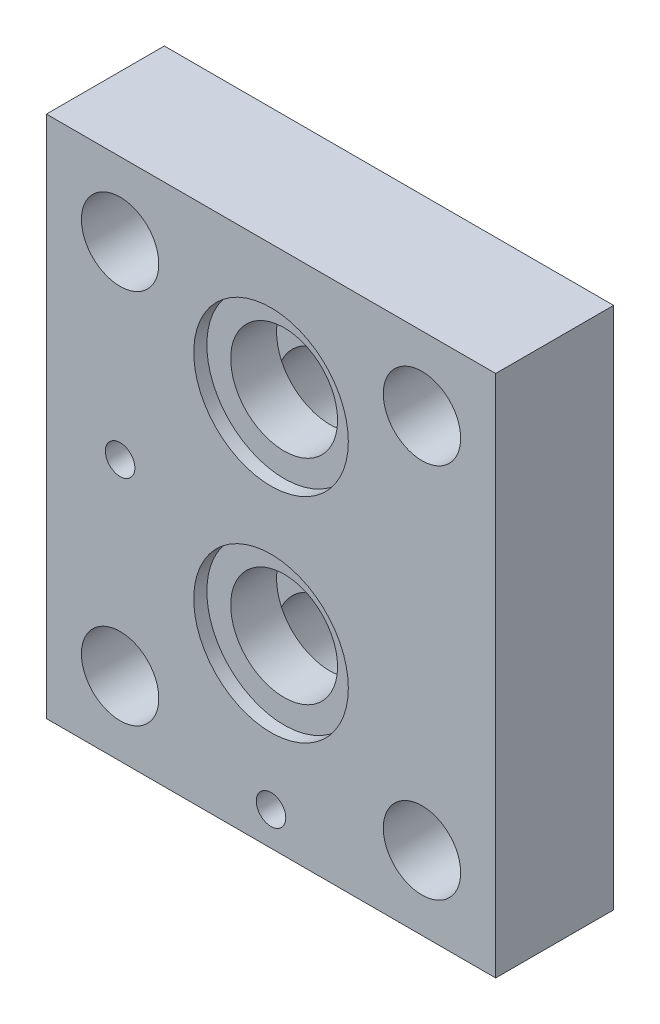
ISO-10303-21;
HEADER;
FILE_DESCRIPTION(('STEP AP214'),'2;1');
FILE_NAME('part.step','',(''),(''),'','','');
FILE_SCHEMA(('AUTOMOTIVE_DESIGN { 1 0 10303 214 1 1 1 1 }'));
ENDSEC;
DATA;
#1=APPLICATION_CONTEXT('core data for automotive mechanical design processes');
#2=APPLICATION_PROTOCOL_DEFINITION('international standard','automotive_design',2000,#1);
#3=PRODUCT_CONTEXT('',#1,'mechanical');
#4=PRODUCT('Part','Part','',(#3));
#5=PRODUCT_RELATED_PRODUCT_CATEGORY('part','',(#4));
#6=PRODUCT_DEFINITION_FORMATION('','',#4);
#7=PRODUCT_DEFINITION_CONTEXT('part definition',#1,'design');
#8=PRODUCT_DEFINITION('design','',#6,#7);
#9=PRODUCT_DEFINITION_SHAPE('','',#8);
#10=(LENGTH_UNIT() NAMED_UNIT(*) SI_UNIT(.MILLI.,.METRE.));
#11=(NAMED_UNIT(*) PLANE_ANGLE_UNIT() SI_UNIT($,.RADIAN.));
#12=(NAMED_UNIT(*) SI_UNIT($,.STERADIAN.) SOLID_ANGLE_UNIT());
#13=UNCERTAINTY_MEASURE_WITH_UNIT(LENGTH_MEASURE(1.E-05),#10,'distance_accuracy_value','');
#14=(GEOMETRIC_REPRESENTATION_CONTEXT(3) GLOBAL_UNCERTAINTY_ASSIGNED_CONTEXT((#13)) GLOBAL_UNIT_ASSIGNED_CONTEXT((#10,
#11,#12)) REPRESENTATION_CONTEXT('',''));
#15=CARTESIAN_POINT('',(0.,0.,0.));
#16=DIRECTION('',(0.,0.,1.));
#17=DIRECTION('',(1.,0.,0.));
#18=AXIS2_PLACEMENT_3D('',#15,#16,#17);
#19=CARTESIAN_POINT('',(0.,27.813,0.));
#20=DIRECTION('',(0.,0.,1.));
#21=DIRECTION('',(1.,0.,0.));
#22=AXIS2_PLACEMENT_3D('',#19,#20,#21);
#23=CYLINDRICAL_SURFACE('',#22,11.509375);
#24=CARTESIAN_POINT('',(0.,27.813,0.));
#25=DIRECTION('',(0.,0.,1.));
#26=DIRECTION('',(1.,0.,0.));
#27=AXIS2_PLACEMENT_3D('',#24,#25,#26);
#28=CIRCLE('',#27,11.509375);
#29=CARTESIAN_POINT('',(-10.4487050341478,22.987,0.));
#30=VERTEX_POINT('',#29);
#31=CARTESIAN_POINT('',(10.4487050341478,22.987,0.));
#32=VERTEX_POINT('',#31);
#33=EDGE_CURVE('E100',#30,#32,#28,.T.);
#34=ORIENTED_EDGE('',*,*,#33,.F.);
#35=EDGE_CURVE('E59',#32,#30,#28,.T.);
#36=ORIENTED_EDGE('',*,*,#35,.F.);
#37=EDGE_LOOP('',(#34,#36));
#38=FACE_BOUND('',#37,.T.);
#39=CARTESIAN_POINT('',(0.,27.813,9.8806));
#40=DIRECTION('',(0.,0.,1.));
#41=DIRECTION('',(1.,0.,0.));
#42=AXIS2_PLACEMENT_3D('',#39,#40,#41);
#43=CIRCLE('',#42,11.509375);
#44=CARTESIAN_POINT('',(11.509375,27.813,9.8806));
#45=VERTEX_POINT('',#44);
#46=EDGE_CURVE('E47',#45,#45,#43,.F.);
#47=ORIENTED_EDGE('',*,*,#46,.F.);
#48=EDGE_LOOP('',(#47));
#49=FACE_BOUND('',#48,.T.);
#50=ADVANCED_FACE('F43',(#38,#49),#23,.F.);
#51=CARTESIAN_POINT('',(0.,-18.161,0.));
#52=DIRECTION('',(0.,0.,1.));
#53=DIRECTION('',(1.,0.,0.));
#54=AXIS2_PLACEMENT_3D('',#51,#52,#53);
#55=CYLINDRICAL_SURFACE('',#54,11.509375);
#56=CARTESIAN_POINT('',(0.,-18.161,0.));
#57=DIRECTION('',(0.,0.,1.));
#58=DIRECTION('',(1.,0.,0.));
#59=AXIS2_PLACEMENT_3D('',#56,#57,#58);
#60=CIRCLE('',#59,11.509375);
#61=CARTESIAN_POINT('',(-10.4487050341478,-22.987,0.));
#62=VERTEX_POINT('',#61);
#63=CARTESIAN_POINT('',(10.4487050341478,-22.987,0.));
#64=VERTEX_POINT('',#63);
#65=EDGE_CURVE('E120',#62,#64,#60,.T.);
#66=ORIENTED_EDGE('',*,*,#65,.F.);
#67=EDGE_CURVE('E66',#64,#62,#60,.T.);
#68=ORIENTED_EDGE('',*,*,#67,.F.);
#69=EDGE_LOOP('',(#66,#68));
#70=FACE_BOUND('',#69,.T.);
#71=CARTESIAN_POINT('',(0.,-18.161,9.8806));
#72=DIRECTION('',(0.,0.,1.));
#73=DIRECTION('',(1.,0.,0.));
#74=AXIS2_PLACEMENT_3D('',#71,#72,#73);
#75=CIRCLE('',#74,11.509375);
#76=CARTESIAN_POINT('',(11.509375,-18.161,9.8806));
#77=VERTEX_POINT('',#76);
#78=EDGE_CURVE('E101',#77,#77,#75,.F.);
#79=ORIENTED_EDGE('',*,*,#78,.F.);
#80=EDGE_LOOP('',(#79));
#81=FACE_BOUND('',#80,.T.);
#82=ADVANCED_FACE('F279',(#70,#81),#55,.F.);
#83=CARTESIAN_POINT('',(48.387,56.388,12.7));
#84=DIRECTION('',(0.,-1.,0.));
#85=DIRECTION('',(0.,0.,-1.));
#86=AXIS2_PLACEMENT_3D('',#83,#84,#85);
#87=PLANE('',#86);
#88=DIRECTION('',(-1.,0.,0.));
#89=VECTOR('',#88,1.);
#90=CARTESIAN_POINT('',(48.387,56.388,-12.7));
#91=LINE('',#90,#89);
#92=CARTESIAN_POINT('',(48.387,56.388,-12.7));
#93=VERTEX_POINT('',#92);
#94=CARTESIAN_POINT('',(-48.387,56.388,-12.7));
#95=VERTEX_POINT('',#94);
#96=EDGE_CURVE('E148',#93,#95,#91,.T.);
#97=ORIENTED_EDGE('',*,*,#96,.T.);
#98=DIRECTION('',(0.,0.,-1.));
#99=VECTOR('',#98,1.);
#100=CARTESIAN_POINT('',(-48.387,56.388,12.7));
#101=LINE('',#100,#99);
#102=CARTESIAN_POINT('',(-48.387,56.388,12.7));
#103=VERTEX_POINT('',#102);
#104=EDGE_CURVE('E11',#103,#95,#101,.T.);
#105=ORIENTED_EDGE('',*,*,#104,.F.);
#106=DIRECTION('',(-1.,0.,0.));
#107=VECTOR('',#106,1.);
#108=CARTESIAN_POINT('',(48.387,56.388,12.7));
#109=LINE('',#108,#107);
#110=CARTESIAN_POINT('',(48.387,56.388,12.7));
#111=VERTEX_POINT('',#110);
#112=EDGE_CURVE('E151',#111,#103,#109,.T.);
#113=ORIENTED_EDGE('',*,*,#112,.F.);
#114=DIRECTION('',(0.,0.,-1.));
#115=VECTOR('',#114,1.);
#116=CARTESIAN_POINT('',(48.387,56.388,12.7));
#117=LINE('',#116,#115);
#118=EDGE_CURVE('E161',#111,#93,#117,.T.);
#119=ORIENTED_EDGE('',*,*,#118,.T.);
#120=EDGE_LOOP('',(#97,#105,#113,#119));
#121=FACE_BOUND('',#120,.T.);
#122=ADVANCED_FACE('F45',(#121),#87,.F.);
#123=CARTESIAN_POINT('',(-48.387,-56.388,12.7));
#124=DIRECTION('',(1.,0.,0.));
#125=DIRECTION('',(0.,0.,-1.));
#126=AXIS2_PLACEMENT_3D('',#123,#124,#125);
#127=PLANE('',#126);
#128=DIRECTION('',(0.,-1.,0.));
#129=VECTOR('',#128,1.);
#130=CARTESIAN_POINT('',(-48.387,-56.388,-12.7));
#131=LINE('',#130,#129);
#132=CARTESIAN_POINT('',(-48.387,-56.388,-12.7));
#133=VERTEX_POINT('',#132);
#134=EDGE_CURVE('E164',#95,#133,#131,.T.);
#135=ORIENTED_EDGE('',*,*,#134,.T.);
#136=DIRECTION('',(0.,0.,-1.));
#137=VECTOR('',#136,1.);
#138=CARTESIAN_POINT('',(-48.387,-56.388,12.7));
#139=LINE('',#138,#137);
#140=CARTESIAN_POINT('',(-48.387,-56.388,12.7));
#141=VERTEX_POINT('',#140);
#142=EDGE_CURVE('E52',#141,#133,#139,.T.);
#143=ORIENTED_EDGE('',*,*,#142,.F.);
#144=DIRECTION('',(0.,-1.,0.));
#145=VECTOR('',#144,1.);
#146=CARTESIAN_POINT('',(-48.387,-56.388,12.7));
#147=LINE('',#146,#145);
#148=EDGE_CURVE('E154',#103,#141,#147,.T.);
#149=ORIENTED_EDGE('',*,*,#148,.F.);
#150=ORIENTED_EDGE('',*,*,#104,.T.);
#151=EDGE_LOOP('',(#135,#143,#149,#150));
#152=FACE_BOUND('',#151,.T.);
#153=ADVANCED_FACE('F255',(#152),#127,.F.);
#154=CARTESIAN_POINT('',(48.387,-56.388,12.7));
#155=DIRECTION('',(0.,1.,0.));
#156=DIRECTION('',(0.,0.,1.));
#157=AXIS2_PLACEMENT_3D('',#154,#155,#156);
#158=PLANE('',#157);
#159=DIRECTION('',(1.,0.,0.));
#160=VECTOR('',#159,1.);
#161=CARTESIAN_POINT('',(48.387,-56.388,-12.7));
#162=LINE('',#161,#160);
#163=CARTESIAN_POINT('',(48.387,-56.388,-12.7));
#164=VERTEX_POINT('',#163);
#165=EDGE_CURVE('E166',#133,#164,#162,.T.);
#166=ORIENTED_EDGE('',*,*,#165,.T.);
#167=DIRECTION('',(0.,0.,-1.));
#168=VECTOR('',#167,1.);
#169=CARTESIAN_POINT('',(48.387,-56.388,12.7));
#170=LINE('',#169,#168);
#171=CARTESIAN_POINT('',(48.387,-56.388,12.7));
#172=VERTEX_POINT('',#171);
#173=EDGE_CURVE('E171',#172,#164,#170,.T.);
#174=ORIENTED_EDGE('',*,*,#173,.F.);
#175=DIRECTION('',(1.,0.,0.));
#176=VECTOR('',#175,1.);
#177=CARTESIAN_POINT('',(48.387,-56.388,12.7));
#178=LINE('',#177,#176);
#179=EDGE_CURVE('E157',#141,#172,#178,.T.);
#180=ORIENTED_EDGE('',*,*,#179,.F.);
#181=ORIENTED_EDGE('',*,*,#142,.T.);
#182=EDGE_LOOP('',(#166,#174,#180,#181));
#183=FACE_BOUND('',#182,.T.);
#184=ADVANCED_FACE('F260',(#183),#158,.F.);
#185=CARTESIAN_POINT('',(48.387,-56.388,12.7));
#186=DIRECTION('',(-1.,0.,0.));
#187=DIRECTION('',(0.,0.,1.));
#188=AXIS2_PLACEMENT_3D('',#185,#186,#187);
#189=PLANE('',#188);
#190=DIRECTION('',(0.,1.,0.));
#191=VECTOR('',#190,1.);
#192=CARTESIAN_POINT('',(48.387,-56.388,-12.7));
#193=LINE('',#192,#191);
#194=EDGE_CURVE('E155',#164,#93,#193,.T.);
#195=ORIENTED_EDGE('',*,*,#194,.T.);
#196=ORIENTED_EDGE('',*,*,#118,.F.);
#197=DIRECTION('',(0.,1.,0.));
#198=VECTOR('',#197,1.);
#199=CARTESIAN_POINT('',(48.387,-56.388,12.7));
#200=LINE('',#199,#198);
#201=EDGE_CURVE('E159',#172,#111,#200,.T.);
#202=ORIENTED_EDGE('',*,*,#201,.F.);
#203=ORIENTED_EDGE('',*,*,#173,.T.);
#204=EDGE_LOOP('',(#195,#196,#202,#203));
#205=FACE_BOUND('',#204,.T.);
#206=ADVANCED_FACE('F231',(#205),#189,.F.);
#207=CARTESIAN_POINT('',(0.,0.,12.7));
#208=DIRECTION('',(0.,0.,-1.));
#209=DIRECTION('',(-1.,0.,0.));
#210=AXIS2_PLACEMENT_3D('',#207,#208,#209);
#211=PLANE('',#210);
#212=CARTESIAN_POINT('',(-32.512,-0.127000000000009,12.7));
#213=DIRECTION('',(0.,0.,1.));
#214=DIRECTION('',(1.,0.,0.));
#215=AXIS2_PLACEMENT_3D('',#212,#213,#214);
#216=CIRCLE('',#215,3.175);
#217=CARTESIAN_POINT('',(-29.337,-0.127000000000009,12.7));
#218=VERTEX_POINT('',#217);
#219=EDGE_CURVE('E212',#218,#218,#216,.T.);
#220=ORIENTED_EDGE('',*,*,#219,.F.);
#221=EDGE_LOOP('',(#220));
#222=FACE_BOUND('',#221,.T.);
#223=CARTESIAN_POINT('',(0.,-49.149,12.7));
#224=DIRECTION('',(0.,0.,1.));
#225=DIRECTION('',(1.,0.,0.));
#226=AXIS2_PLACEMENT_3D('',#223,#224,#225);
#227=CIRCLE('',#226,3.175);
#228=CARTESIAN_POINT('',(3.175,-49.149,12.7));
#229=VERTEX_POINT('',#228);
#230=EDGE_CURVE('E206',#229,#229,#227,.T.);
#231=ORIENTED_EDGE('',*,*,#230,.F.);
#232=EDGE_LOOP('',(#231));
#233=FACE_BOUND('',#232,.T.);
#234=CARTESIAN_POINT('',(0.,27.813,12.7));
#235=DIRECTION('',(0.,0.,1.));
#236=DIRECTION('',(1.,0.,0.));
#237=AXIS2_PLACEMENT_3D('',#234,#235,#236);
#238=CIRCLE('',#237,16.6497);
#239=CARTESIAN_POINT('',(16.6497,27.813,12.7));
#240=VERTEX_POINT('',#239);
#241=EDGE_CURVE('E187',#240,#240,#238,.T.);
#242=ORIENTED_EDGE('',*,*,#241,.F.);
#243=EDGE_LOOP('',(#242));
#244=FACE_BOUND('',#243,.T.);
#245=CARTESIAN_POINT('',(0.,-18.161,12.7));
#246=DIRECTION('',(0.,0.,1.));
#247=DIRECTION('',(1.,0.,0.));
#248=AXIS2_PLACEMENT_3D('',#245,#246,#247);
#249=CIRCLE('',#248,16.6497);
#250=CARTESIAN_POINT('',(16.6497,-18.161,12.7));
#251=VERTEX_POINT('',#250);
#252=EDGE_CURVE('E180',#251,#251,#249,.T.);
#253=ORIENTED_EDGE('',*,*,#252,.F.);
#254=EDGE_LOOP('',(#253));
#255=FACE_BOUND('',#254,.T.);
#256=CARTESIAN_POINT('',(32.512,40.513,12.7));
#257=DIRECTION('',(0.,0.,-1.));
#258=DIRECTION('',(-1.,0.,0.));
#259=AXIS2_PLACEMENT_3D('',#256,#257,#258);
#260=CIRCLE('',#259,8.334375);
#261=CARTESIAN_POINT('',(24.177625,40.513,12.7));
#262=VERTEX_POINT('',#261);
#263=EDGE_CURVE('E131',#262,#262,#260,.T.);
#264=ORIENTED_EDGE('',*,*,#263,.T.);
#265=EDGE_LOOP('',(#264));
#266=FACE_BOUND('',#265,.T.);
#267=CARTESIAN_POINT('',(-32.512,-40.513,12.7));
#268=DIRECTION('',(0.,0.,-1.));
#269=DIRECTION('',(-1.,0.,0.));
#270=AXIS2_PLACEMENT_3D('',#267,#268,#269);
#271=CIRCLE('',#270,8.334375);
#272=CARTESIAN_POINT('',(-40.846375,-40.513,12.7));
#273=VERTEX_POINT('',#272);
#274=EDGE_CURVE('E134',#273,#273,#271,.T.);
#275=ORIENTED_EDGE('',*,*,#274,.T.);
#276=EDGE_LOOP('',(#275));
#277=FACE_BOUND('',#276,.T.);
#278=CARTESIAN_POINT('',(-32.512,40.513,12.7));
#279=DIRECTION('',(0.,0.,-1.));
#280=DIRECTION('',(-1.,0.,0.));
#281=AXIS2_PLACEMENT_3D('',#278,#279,#280);
#282=CIRCLE('',#281,8.334375);
#283=CARTESIAN_POINT('',(-40.846375,40.513,12.7));
#284=VERTEX_POINT('',#283);
#285=EDGE_CURVE('E140',#284,#284,#282,.T.);
#286=ORIENTED_EDGE('',*,*,#285,.T.);
#287=EDGE_LOOP('',(#286));
#288=FACE_BOUND('',#287,.T.);
#289=CARTESIAN_POINT('',(32.512,-40.513,12.7));
#290=DIRECTION('',(0.,0.,-1.));
#291=DIRECTION('',(-1.,0.,0.));
#292=AXIS2_PLACEMENT_3D('',#289,#290,#291);
#293=CIRCLE('',#292,8.334375);
#294=CARTESIAN_POINT('',(24.177625,-40.513,12.7));
#295=VERTEX_POINT('',#294);
#296=EDGE_CURVE('E130',#295,#295,#293,.T.);
#297=ORIENTED_EDGE('',*,*,#296,.T.);
#298=EDGE_LOOP('',(#297));
#299=FACE_BOUND('',#298,.T.);
#300=ORIENTED_EDGE('',*,*,#112,.T.);
#301=ORIENTED_EDGE('',*,*,#148,.T.);
#302=ORIENTED_EDGE('',*,*,#179,.T.);
#303=ORIENTED_EDGE('',*,*,#201,.T.);
#304=EDGE_LOOP('',(#300,#301,#302,#303));
#305=FACE_BOUND('',#304,.T.);
#306=ADVANCED_FACE('F227',(#222,#233,#244,#255,#266,#277,#288,#299,#305),#211,.F.);
#307=CARTESIAN_POINT('',(0.,0.,-12.7));
#308=DIRECTION('',(0.,0.,-1.));
#309=DIRECTION('',(-1.,0.,0.));
#310=AXIS2_PLACEMENT_3D('',#307,#308,#309);
#311=PLANE('',#310);
#312=CARTESIAN_POINT('',(32.512,0.126999999999986,-12.7));
#313=DIRECTION('',(0.,0.,1.));
#314=DIRECTION('',(1.,0.,0.));
#315=AXIS2_PLACEMENT_3D('',#312,#313,#314);
#316=CIRCLE('',#315,3.571875);
#317=CARTESIAN_POINT('',(36.083875,0.126999999999986,-12.7));
#318=VERTEX_POINT('',#317);
#319=EDGE_CURVE('E200',#318,#318,#316,.T.);
#320=ORIENTED_EDGE('',*,*,#319,.T.);
#321=EDGE_LOOP('',(#320));
#322=FACE_BOUND('',#321,.T.);
#323=CARTESIAN_POINT('',(0.,49.149,-12.7));
#324=DIRECTION('',(0.,0.,1.));
#325=DIRECTION('',(1.,0.,0.));
#326=AXIS2_PLACEMENT_3D('',#323,#324,#325);
#327=CIRCLE('',#326,3.571875);
#328=CARTESIAN_POINT('',(3.571875,49.149,-12.7));
#329=VERTEX_POINT('',#328);
#330=EDGE_CURVE('E194',#329,#329,#327,.T.);
#331=ORIENTED_EDGE('',*,*,#330,.T.);
#332=EDGE_LOOP('',(#331));
#333=FACE_BOUND('',#332,.T.);
#334=CARTESIAN_POINT('',(0.,18.161,-12.7));
#335=DIRECTION('',(0.,0.,1.));
#336=DIRECTION('',(1.,0.,0.));
#337=AXIS2_PLACEMENT_3D('',#334,#335,#336);
#338=CIRCLE('',#337,11.509375);
#339=CARTESIAN_POINT('',(11.509375,18.161,-12.7));
#340=VERTEX_POINT('',#339);
#341=EDGE_CURVE('E110',#340,#340,#338,.T.);
#342=ORIENTED_EDGE('',*,*,#341,.T.);
#343=EDGE_LOOP('',(#342));
#344=FACE_BOUND('',#343,.T.);
#345=CARTESIAN_POINT('',(0.,-27.813,-12.7));
#346=DIRECTION('',(0.,0.,1.));
#347=DIRECTION('',(1.,0.,0.));
#348=AXIS2_PLACEMENT_3D('',#345,#346,#347);
#349=CIRCLE('',#348,11.509375);
#350=CARTESIAN_POINT('',(11.509375,-27.813,-12.7));
#351=VERTEX_POINT('',#350);
#352=EDGE_CURVE('E114',#351,#351,#349,.T.);
#353=ORIENTED_EDGE('',*,*,#352,.T.);
#354=EDGE_LOOP('',(#353));
#355=FACE_BOUND('',#354,.T.);
#356=CARTESIAN_POINT('',(32.512,40.513,-12.7));
#357=DIRECTION('',(0.,0.,1.));
#358=DIRECTION('',(1.,0.,0.));
#359=AXIS2_PLACEMENT_3D('',#356,#357,#358);
#360=CIRCLE('',#359,8.334375);
#361=CARTESIAN_POINT('',(24.177625,40.513,-12.7));
#362=VERTEX_POINT('',#361);
#363=EDGE_CURVE('E127',#362,#362,#360,.T.);
#364=ORIENTED_EDGE('',*,*,#363,.T.);
#365=EDGE_LOOP('',(#364));
#366=FACE_BOUND('',#365,.T.);
#367=CARTESIAN_POINT('',(-32.512,-40.513,-12.7));
#368=DIRECTION('',(0.,0.,1.));
#369=DIRECTION('',(1.,0.,0.));
#370=AXIS2_PLACEMENT_3D('',#367,#368,#369);
#371=CIRCLE('',#370,8.334375);
#372=CARTESIAN_POINT('',(-40.846375,-40.513,-12.7));
#373=VERTEX_POINT('',#372);
#374=EDGE_CURVE('E137',#373,#373,#371,.T.);
#375=ORIENTED_EDGE('',*,*,#374,.T.);
#376=EDGE_LOOP('',(#375));
#377=FACE_BOUND('',#376,.T.);
#378=CARTESIAN_POINT('',(-32.512,40.513,-12.7));
#379=DIRECTION('',(0.,0.,1.));
#380=DIRECTION('',(1.,0.,0.));
#381=AXIS2_PLACEMENT_3D('',#378,#379,#380);
#382=CIRCLE('',#381,8.334375);
#383=CARTESIAN_POINT('',(-40.846375,40.513,-12.7));
#384=VERTEX_POINT('',#383);
#385=EDGE_CURVE('E125',#384,#384,#382,.T.);
#386=ORIENTED_EDGE('',*,*,#385,.T.);
#387=EDGE_LOOP('',(#386));
#388=FACE_BOUND('',#387,.T.);
#389=CARTESIAN_POINT('',(32.512,-40.513,-12.7));
#390=DIRECTION('',(0.,0.,1.));
#391=DIRECTION('',(1.,0.,0.));
#392=AXIS2_PLACEMENT_3D('',#389,#390,#391);
#393=CIRCLE('',#392,8.334375);
#394=CARTESIAN_POINT('',(24.177625,-40.513,-12.7));
#395=VERTEX_POINT('',#394);
#396=EDGE_CURVE('E145',#395,#395,#393,.T.);
#397=ORIENTED_EDGE('',*,*,#396,.T.);
#398=EDGE_LOOP('',(#397));
#399=FACE_BOUND('',#398,.T.);
#400=ORIENTED_EDGE('',*,*,#96,.F.);
#401=ORIENTED_EDGE('',*,*,#194,.F.);
#402=ORIENTED_EDGE('',*,*,#165,.F.);
#403=ORIENTED_EDGE('',*,*,#134,.F.);
#404=EDGE_LOOP('',(#400,#401,#402,#403));
#405=FACE_BOUND('',#404,.T.);
#406=ADVANCED_FACE('F230',(#322,#333,#344,#355,#366,#377,#388,#399,#405),#311,.T.);
#407=CARTESIAN_POINT('',(32.512,-40.513,12.701));
#408=DIRECTION('',(0.,0.,-1.));
#409=DIRECTION('',(-1.,0.,0.));
#410=AXIS2_PLACEMENT_3D('',#407,#408,#409);
#411=CYLINDRICAL_SURFACE('',#410,8.334375);
#412=CARTESIAN_POINT('',(24.177625,-40.513,-12.7));
#413=CARTESIAN_POINT('',(24.177625,-40.513,-12.4354166666667));
#414=CARTESIAN_POINT('',(24.177625,-40.513,-12.1708333333333));
#415=CARTESIAN_POINT('',(24.177625,-40.513,-11.6416666666667));
#416=CARTESIAN_POINT('',(24.177625,-40.513,-11.3770833333333));
#417=CARTESIAN_POINT('',(24.177625,-40.513,-10.8479166666667));
#418=CARTESIAN_POINT('',(24.177625,-40.513,-10.5833333333333));
#419=CARTESIAN_POINT('',(24.177625,-40.513,-10.0541666666667));
#420=CARTESIAN_POINT('',(24.177625,-40.513,-9.78958333333334));
#421=CARTESIAN_POINT('',(24.177625,-40.513,-9.26041666666667));
#422=CARTESIAN_POINT('',(24.177625,-40.513,-8.99583333333334));
#423=CARTESIAN_POINT('',(24.177625,-40.513,-8.46666666666667));
#424=CARTESIAN_POINT('',(24.177625,-40.513,-8.20208333333333));
#425=CARTESIAN_POINT('',(24.177625,-40.513,-7.67291666666667));
#426=CARTESIAN_POINT('',(24.177625,-40.513,-7.40833333333333));
#427=CARTESIAN_POINT('',(24.177625,-40.513,-6.87916666666667));
#428=CARTESIAN_POINT('',(24.177625,-40.513,-6.61458333333333));
#429=CARTESIAN_POINT('',(24.177625,-40.513,-6.08541666666667));
#430=CARTESIAN_POINT('',(24.177625,-40.513,-5.82083333333333));
#431=CARTESIAN_POINT('',(24.177625,-40.513,-5.29166666666667));
#432=CARTESIAN_POINT('',(24.177625,-40.513,-5.02708333333334));
#433=CARTESIAN_POINT('',(24.177625,-40.513,-4.49791666666667));
#434=CARTESIAN_POINT('',(24.177625,-40.513,-4.23333333333333));
#435=CARTESIAN_POINT('',(24.177625,-40.513,-3.70416666666667));
#436=CARTESIAN_POINT('',(24.177625,-40.513,-3.43958333333333));
#437=CARTESIAN_POINT('',(24.177625,-40.513,-2.91041666666667));
#438=CARTESIAN_POINT('',(24.177625,-40.513,-2.64583333333334));
#439=CARTESIAN_POINT('',(24.177625,-40.513,-2.11666666666667));
#440=CARTESIAN_POINT('',(24.177625,-40.513,-1.85208333333334));
#441=CARTESIAN_POINT('',(24.177625,-40.513,-1.32291666666667));
#442=CARTESIAN_POINT('',(24.177625,-40.513,-1.05833333333333));
#443=CARTESIAN_POINT('',(24.177625,-40.513,-0.529166666666668));
#444=CARTESIAN_POINT('',(24.177625,-40.513,-0.264583333333335));
#445=CARTESIAN_POINT('',(24.177625,-40.513,0.264583333333331));
#446=CARTESIAN_POINT('',(24.177625,-40.513,0.529166666666664));
#447=CARTESIAN_POINT('',(24.177625,-40.513,1.05833333333333));
#448=CARTESIAN_POINT('',(24.177625,-40.513,1.32291666666666));
#449=CARTESIAN_POINT('',(24.177625,-40.513,1.85208333333333));
#450=CARTESIAN_POINT('',(24.177625,-40.513,2.11666666666667));
#451=CARTESIAN_POINT('',(24.177625,-40.513,2.64583333333333));
#452=CARTESIAN_POINT('',(24.177625,-40.513,2.91041666666667));
#453=CARTESIAN_POINT('',(24.177625,-40.513,3.43958333333333));
#454=CARTESIAN_POINT('',(24.177625,-40.513,3.70416666666667));
#455=CARTESIAN_POINT('',(24.177625,-40.513,4.23333333333333));
#456=CARTESIAN_POINT('',(24.177625,-40.513,4.49791666666667));
#457=CARTESIAN_POINT('',(24.177625,-40.513,5.02708333333333));
#458=CARTESIAN_POINT('',(24.177625,-40.513,5.29166666666667));
#459=CARTESIAN_POINT('',(24.177625,-40.513,5.82083333333333));
#460=CARTESIAN_POINT('',(24.177625,-40.513,6.08541666666667));
#461=CARTESIAN_POINT('',(24.177625,-40.513,6.61458333333333));
#462=CARTESIAN_POINT('',(24.177625,-40.513,6.87916666666667));
#463=CARTESIAN_POINT('',(24.177625,-40.513,7.40833333333333));
#464=CARTESIAN_POINT('',(24.177625,-40.513,7.67291666666666));
#465=CARTESIAN_POINT('',(24.177625,-40.513,8.20208333333333));
#466=CARTESIAN_POINT('',(24.177625,-40.513,8.46666666666667));
#467=CARTESIAN_POINT('',(24.177625,-40.513,8.99583333333333));
#468=CARTESIAN_POINT('',(24.177625,-40.513,9.26041666666666));
#469=CARTESIAN_POINT('',(24.177625,-40.513,9.78958333333333));
#470=CARTESIAN_POINT('',(24.177625,-40.513,10.0541666666667));
#471=CARTESIAN_POINT('',(24.177625,-40.513,10.5833333333333));
#472=CARTESIAN_POINT('',(24.177625,-40.513,10.8479166666667));
#473=CARTESIAN_POINT('',(24.177625,-40.513,11.3770833333333));
#474=CARTESIAN_POINT('',(24.177625,-40.513,11.6416666666667));
#475=CARTESIAN_POINT('',(24.177625,-40.513,12.1708333333333));
#476=CARTESIAN_POINT('',(24.177625,-40.513,12.4354166666667));
#477=CARTESIAN_POINT('',(24.177625,-40.513,12.7));
#478=B_SPLINE_CURVE_WITH_KNOTS('',3,(#412,#413,#414,#415,#416,#417,#418,#419,#420,#421,#422,
#423,#424,#425,#426,#427,#428,#429,#430,#431,#432,#433,#434,#435,#436,#437,#438,#439,#440,#441,
#442,#443,#444,#445,#446,#447,#448,#449,#450,#451,#452,#453,#454,#455,#456,#457,#458,#459,#460,
#461,#462,#463,#464,#465,#466,#467,#468,#469,#470,#471,#472,#473,#474,#475,#476,#477),
.UNSPECIFIED.,.F.,.F.,(4,2,2,2,2,2,2,2,2,2,2,2,2,2,2,2,2,2,2,2,2,2,2,2,2,2,2,2,2,2,2,2,4),(0.,
0.793749999999999,1.5875,2.38125,3.175,3.96875,4.7625,5.55625,6.35,7.14375,7.9375,8.73125,9.525,
10.31875,11.1125,11.90625,12.7,13.49375,14.2875,15.08125,15.875,16.66875,17.4625,18.25625,19.05,
19.84375,20.6375,21.43125,22.225,23.01875,23.8125,24.60625,25.4),.UNSPECIFIED.);
#479=EDGE_CURVE('BSEAM265',#395,#295,#478,.T.);
#480=ORIENTED_EDGE('',*,*,#396,.F.);
#481=ORIENTED_EDGE('',*,*,#296,.F.);
#482=ORIENTED_EDGE('',*,*,#479,.T.);
#483=ORIENTED_EDGE('',*,*,#479,.F.);
#484=EDGE_LOOP('',(#480,#482,#481,#483));
#485=FACE_BOUND('',#484,.T.);
#486=ADVANCED_FACE('F265',(#485),#411,.F.);
#487=CARTESIAN_POINT('',(-32.512,40.513,12.701));
#488=DIRECTION('',(0.,0.,-1.));
#489=DIRECTION('',(-1.,0.,0.));
#490=AXIS2_PLACEMENT_3D('',#487,#488,#489);
#491=CYLINDRICAL_SURFACE('',#490,8.334375);
#492=CARTESIAN_POINT('',(-40.846375,40.513,-12.7));
#493=CARTESIAN_POINT('',(-40.846375,40.513,-12.4354166666667));
#494=CARTESIAN_POINT('',(-40.846375,40.513,-12.1708333333333));
#495=CARTESIAN_POINT('',(-40.846375,40.513,-11.6416666666667));
#496=CARTESIAN_POINT('',(-40.846375,40.513,-11.3770833333333));
#497=CARTESIAN_POINT('',(-40.846375,40.513,-10.8479166666667));
#498=CARTESIAN_POINT('',(-40.846375,40.513,-10.5833333333333));
#499=CARTESIAN_POINT('',(-40.846375,40.513,-10.0541666666667));
#500=CARTESIAN_POINT('',(-40.846375,40.513,-9.78958333333334));
#501=CARTESIAN_POINT('',(-40.846375,40.513,-9.26041666666667));
#502=CARTESIAN_POINT('',(-40.846375,40.513,-8.99583333333334));
#503=CARTESIAN_POINT('',(-40.846375,40.513,-8.46666666666667));
#504=CARTESIAN_POINT('',(-40.846375,40.513,-8.20208333333333));
#505=CARTESIAN_POINT('',(-40.846375,40.513,-7.67291666666667));
#506=CARTESIAN_POINT('',(-40.846375,40.513,-7.40833333333333));
#507=CARTESIAN_POINT('',(-40.846375,40.513,-6.87916666666667));
#508=CARTESIAN_POINT('',(-40.846375,40.513,-6.61458333333333));
#509=CARTESIAN_POINT('',(-40.846375,40.513,-6.08541666666667));
#510=CARTESIAN_POINT('',(-40.846375,40.513,-5.82083333333333));
#511=CARTESIAN_POINT('',(-40.846375,40.513,-5.29166666666667));
#512=CARTESIAN_POINT('',(-40.846375,40.513,-5.02708333333334));
#513=CARTESIAN_POINT('',(-40.846375,40.513,-4.49791666666667));
#514=CARTESIAN_POINT('',(-40.846375,40.513,-4.23333333333333));
#515=CARTESIAN_POINT('',(-40.846375,40.513,-3.70416666666667));
#516=CARTESIAN_POINT('',(-40.846375,40.513,-3.43958333333333));
#517=CARTESIAN_POINT('',(-40.846375,40.513,-2.91041666666667));
#518=CARTESIAN_POINT('',(-40.846375,40.513,-2.64583333333334));
#519=CARTESIAN_POINT('',(-40.846375,40.513,-2.11666666666667));
#520=CARTESIAN_POINT('',(-40.846375,40.513,-1.85208333333334));
#521=CARTESIAN_POINT('',(-40.846375,40.513,-1.32291666666667));
#522=CARTESIAN_POINT('',(-40.846375,40.513,-1.05833333333333));
#523=CARTESIAN_POINT('',(-40.846375,40.513,-0.529166666666668));
#524=CARTESIAN_POINT('',(-40.846375,40.513,-0.264583333333335));
#525=CARTESIAN_POINT('',(-40.846375,40.513,0.264583333333331));
#526=CARTESIAN_POINT('',(-40.846375,40.513,0.529166666666664));
#527=CARTESIAN_POINT('',(-40.846375,40.513,1.05833333333333));
#528=CARTESIAN_POINT('',(-40.846375,40.513,1.32291666666666));
#529=CARTESIAN_POINT('',(-40.846375,40.513,1.85208333333333));
#530=CARTESIAN_POINT('',(-40.846375,40.513,2.11666666666667));
#531=CARTESIAN_POINT('',(-40.846375,40.513,2.64583333333333));
#532=CARTESIAN_POINT('',(-40.846375,40.513,2.91041666666667));
#533=CARTESIAN_POINT('',(-40.846375,40.513,3.43958333333333));
#534=CARTESIAN_POINT('',(-40.846375,40.513,3.70416666666667));
#535=CARTESIAN_POINT('',(-40.846375,40.513,4.23333333333333));
#536=CARTESIAN_POINT('',(-40.846375,40.513,4.49791666666667));
#537=CARTESIAN_POINT('',(-40.846375,40.513,5.02708333333333));
#538=CARTESIAN_POINT('',(-40.846375,40.513,5.29166666666667));
#539=CARTESIAN_POINT('',(-40.846375,40.513,5.82083333333333));
#540=CARTESIAN_POINT('',(-40.846375,40.513,6.08541666666667));
#541=CARTESIAN_POINT('',(-40.846375,40.513,6.61458333333333));
#542=CARTESIAN_POINT('',(-40.846375,40.513,6.87916666666667));
#543=CARTESIAN_POINT('',(-40.846375,40.513,7.40833333333333));
#544=CARTESIAN_POINT('',(-40.846375,40.513,7.67291666666666));
#545=CARTESIAN_POINT('',(-40.846375,40.513,8.20208333333333));
#546=CARTESIAN_POINT('',(-40.846375,40.513,8.46666666666667));
#547=CARTESIAN_POINT('',(-40.846375,40.513,8.99583333333333));
#548=CARTESIAN_POINT('',(-40.846375,40.513,9.26041666666666));
#549=CARTESIAN_POINT('',(-40.846375,40.513,9.78958333333333));
#550=CARTESIAN_POINT('',(-40.846375,40.513,10.0541666666667));
#551=CARTESIAN_POINT('',(-40.846375,40.513,10.5833333333333));
#552=CARTESIAN_POINT('',(-40.846375,40.513,10.8479166666667));
#553=CARTESIAN_POINT('',(-40.846375,40.513,11.3770833333333));
#554=CARTESIAN_POINT('',(-40.846375,40.513,11.6416666666667));
#555=CARTESIAN_POINT('',(-40.846375,40.513,12.1708333333333));
#556=CARTESIAN_POINT('',(-40.846375,40.513,12.4354166666667));
#557=CARTESIAN_POINT('',(-40.846375,40.513,12.7));
#558=B_SPLINE_CURVE_WITH_KNOTS('',3,(#492,#493,#494,#495,#496,#497,#498,#499,#500,#501,#502,
#503,#504,#505,#506,#507,#508,#509,#510,#511,#512,#513,#514,#515,#516,#517,#518,#519,#520,#521,
#522,#523,#524,#525,#526,#527,#528,#529,#530,#531,#532,#533,#534,#535,#536,#537,#538,#539,#540,
#541,#542,#543,#544,#545,#546,#547,#548,#549,#550,#551,#552,#553,#554,#555,#556,#557),
.UNSPECIFIED.,.F.,.F.,(4,2,2,2,2,2,2,2,2,2,2,2,2,2,2,2,2,2,2,2,2,2,2,2,2,2,2,2,2,2,2,2,4),(0.,
0.793749999999999,1.5875,2.38125,3.175,3.96875,4.7625,5.55625,6.35,7.14375,7.9375,8.73125,9.525,
10.31875,11.1125,11.90625,12.7,13.49375,14.2875,15.08125,15.875,16.66875,17.4625,18.25625,19.05,
19.84375,20.6375,21.43125,22.225,23.01875,23.8125,24.60625,25.4),.UNSPECIFIED.);
#559=EDGE_CURVE('BSEAM273',#384,#284,#558,.T.);
#560=ORIENTED_EDGE('',*,*,#385,.F.);
#561=ORIENTED_EDGE('',*,*,#285,.F.);
#562=ORIENTED_EDGE('',*,*,#559,.T.);
#563=ORIENTED_EDGE('',*,*,#559,.F.);
#564=EDGE_LOOP('',(#560,#562,#561,#563));
#565=FACE_BOUND('',#564,.T.);
#566=ADVANCED_FACE('F273',(#565),#491,.F.);
#567=CARTESIAN_POINT('',(-32.512,-40.513,12.701));
#568=DIRECTION('',(0.,0.,-1.));
#569=DIRECTION('',(-1.,0.,0.));
#570=AXIS2_PLACEMENT_3D('',#567,#568,#569);
#571=CYLINDRICAL_SURFACE('',#570,8.334375);
#572=CARTESIAN_POINT('',(-40.846375,-40.513,-12.7));
#573=CARTESIAN_POINT('',(-40.846375,-40.513,-12.4354166666667));
#574=CARTESIAN_POINT('',(-40.846375,-40.513,-12.1708333333333));
#575=CARTESIAN_POINT('',(-40.846375,-40.513,-11.6416666666667));
#576=CARTESIAN_POINT('',(-40.846375,-40.513,-11.3770833333333));
#577=CARTESIAN_POINT('',(-40.846375,-40.513,-10.8479166666667));
#578=CARTESIAN_POINT('',(-40.846375,-40.513,-10.5833333333333));
#579=CARTESIAN_POINT('',(-40.846375,-40.513,-10.0541666666667));
#580=CARTESIAN_POINT('',(-40.846375,-40.513,-9.78958333333334));
#581=CARTESIAN_POINT('',(-40.846375,-40.513,-9.26041666666667));
#582=CARTESIAN_POINT('',(-40.846375,-40.513,-8.99583333333334));
#583=CARTESIAN_POINT('',(-40.846375,-40.513,-8.46666666666667));
#584=CARTESIAN_POINT('',(-40.846375,-40.513,-8.20208333333333));
#585=CARTESIAN_POINT('',(-40.846375,-40.513,-7.67291666666667));
#586=CARTESIAN_POINT('',(-40.846375,-40.513,-7.40833333333333));
#587=CARTESIAN_POINT('',(-40.846375,-40.513,-6.87916666666667));
#588=CARTESIAN_POINT('',(-40.846375,-40.513,-6.61458333333333));
#589=CARTESIAN_POINT('',(-40.846375,-40.513,-6.08541666666667));
#590=CARTESIAN_POINT('',(-40.846375,-40.513,-5.82083333333333));
#591=CARTESIAN_POINT('',(-40.846375,-40.513,-5.29166666666667));
#592=CARTESIAN_POINT('',(-40.846375,-40.513,-5.02708333333334));
#593=CARTESIAN_POINT('',(-40.846375,-40.513,-4.49791666666667));
#594=CARTESIAN_POINT('',(-40.846375,-40.513,-4.23333333333333));
#595=CARTESIAN_POINT('',(-40.846375,-40.513,-3.70416666666667));
#596=CARTESIAN_POINT('',(-40.846375,-40.513,-3.43958333333333));
#597=CARTESIAN_POINT('',(-40.846375,-40.513,-2.91041666666667));
#598=CARTESIAN_POINT('',(-40.846375,-40.513,-2.64583333333334));
#599=CARTESIAN_POINT('',(-40.846375,-40.513,-2.11666666666667));
#600=CARTESIAN_POINT('',(-40.846375,-40.513,-1.85208333333334));
#601=CARTESIAN_POINT('',(-40.846375,-40.513,-1.32291666666667));
#602=CARTESIAN_POINT('',(-40.846375,-40.513,-1.05833333333333));
#603=CARTESIAN_POINT('',(-40.846375,-40.513,-0.529166666666668));
#604=CARTESIAN_POINT('',(-40.846375,-40.513,-0.264583333333335));
#605=CARTESIAN_POINT('',(-40.846375,-40.513,0.264583333333331));
#606=CARTESIAN_POINT('',(-40.846375,-40.513,0.529166666666664));
#607=CARTESIAN_POINT('',(-40.846375,-40.513,1.05833333333333));
#608=CARTESIAN_POINT('',(-40.846375,-40.513,1.32291666666666));
#609=CARTESIAN_POINT('',(-40.846375,-40.513,1.85208333333333));
#610=CARTESIAN_POINT('',(-40.846375,-40.513,2.11666666666667));
#611=CARTESIAN_POINT('',(-40.846375,-40.513,2.64583333333333));
#612=CARTESIAN_POINT('',(-40.846375,-40.513,2.91041666666667));
#613=CARTESIAN_POINT('',(-40.846375,-40.513,3.43958333333333));
#614=CARTESIAN_POINT('',(-40.846375,-40.513,3.70416666666667));
#615=CARTESIAN_POINT('',(-40.846375,-40.513,4.23333333333333));
#616=CARTESIAN_POINT('',(-40.846375,-40.513,4.49791666666667));
#617=CARTESIAN_POINT('',(-40.846375,-40.513,5.02708333333333));
#618=CARTESIAN_POINT('',(-40.846375,-40.513,5.29166666666667));
#619=CARTESIAN_POINT('',(-40.846375,-40.513,5.82083333333333));
#620=CARTESIAN_POINT('',(-40.846375,-40.513,6.08541666666667));
#621=CARTESIAN_POINT('',(-40.846375,-40.513,6.61458333333333));
#622=CARTESIAN_POINT('',(-40.846375,-40.513,6.87916666666667));
#623=CARTESIAN_POINT('',(-40.846375,-40.513,7.40833333333333));
#624=CARTESIAN_POINT('',(-40.846375,-40.513,7.67291666666666));
#625=CARTESIAN_POINT('',(-40.846375,-40.513,8.20208333333333));
#626=CARTESIAN_POINT('',(-40.846375,-40.513,8.46666666666667));
#627=CARTESIAN_POINT('',(-40.846375,-40.513,8.99583333333333));
#628=CARTESIAN_POINT('',(-40.846375,-40.513,9.26041666666666));
#629=CARTESIAN_POINT('',(-40.846375,-40.513,9.78958333333333));
#630=CARTESIAN_POINT('',(-40.846375,-40.513,10.0541666666667));
#631=CARTESIAN_POINT('',(-40.846375,-40.513,10.5833333333333));
#632=CARTESIAN_POINT('',(-40.846375,-40.513,10.8479166666667));
#633=CARTESIAN_POINT('',(-40.846375,-40.513,11.3770833333333));
#634=CARTESIAN_POINT('',(-40.846375,-40.513,11.6416666666667));
#635=CARTESIAN_POINT('',(-40.846375,-40.513,12.1708333333333));
#636=CARTESIAN_POINT('',(-40.846375,-40.513,12.4354166666667));
#637=CARTESIAN_POINT('',(-40.846375,-40.513,12.7));
#638=B_SPLINE_CURVE_WITH_KNOTS('',3,(#572,#573,#574,#575,#576,#577,#578,#579,#580,#581,#582,
#583,#584,#585,#586,#587,#588,#589,#590,#591,#592,#593,#594,#595,#596,#597,#598,#599,#600,#601,
#602,#603,#604,#605,#606,#607,#608,#609,#610,#611,#612,#613,#614,#615,#616,#617,#618,#619,#620,
#621,#622,#623,#624,#625,#626,#627,#628,#629,#630,#631,#632,#633,#634,#635,#636,#637),
.UNSPECIFIED.,.F.,.F.,(4,2,2,2,2,2,2,2,2,2,2,2,2,2,2,2,2,2,2,2,2,2,2,2,2,2,2,2,2,2,2,2,4),(0.,
0.793749999999999,1.5875,2.38125,3.175,3.96875,4.7625,5.55625,6.35,7.14375,7.9375,8.73125,9.525,
10.31875,11.1125,11.90625,12.7,13.49375,14.2875,15.08125,15.875,16.66875,17.4625,18.25625,19.05,
19.84375,20.6375,21.43125,22.225,23.01875,23.8125,24.60625,25.4),.UNSPECIFIED.);
#639=EDGE_CURVE('BSEAM309',#373,#273,#638,.T.);
#640=ORIENTED_EDGE('',*,*,#374,.F.);
#641=ORIENTED_EDGE('',*,*,#274,.F.);
#642=ORIENTED_EDGE('',*,*,#639,.T.);
#643=ORIENTED_EDGE('',*,*,#639,.F.);
#644=EDGE_LOOP('',(#640,#642,#641,#643));
#645=FACE_BOUND('',#644,.T.);
#646=ADVANCED_FACE('F309',(#645),#571,.F.);
#647=CARTESIAN_POINT('',(32.512,40.513,12.701));
#648=DIRECTION('',(0.,0.,-1.));
#649=DIRECTION('',(-1.,0.,0.));
#650=AXIS2_PLACEMENT_3D('',#647,#648,#649);
#651=CYLINDRICAL_SURFACE('',#650,8.334375);
#652=CARTESIAN_POINT('',(24.177625,40.513,-12.7));
#653=CARTESIAN_POINT('',(24.177625,40.513,-12.4354166666667));
#654=CARTESIAN_POINT('',(24.177625,40.513,-12.1708333333333));
#655=CARTESIAN_POINT('',(24.177625,40.513,-11.6416666666667));
#656=CARTESIAN_POINT('',(24.177625,40.513,-11.3770833333333));
#657=CARTESIAN_POINT('',(24.177625,40.513,-10.8479166666667));
#658=CARTESIAN_POINT('',(24.177625,40.513,-10.5833333333333));
#659=CARTESIAN_POINT('',(24.177625,40.513,-10.0541666666667));
#660=CARTESIAN_POINT('',(24.177625,40.513,-9.78958333333334));
#661=CARTESIAN_POINT('',(24.177625,40.513,-9.26041666666667));
#662=CARTESIAN_POINT('',(24.177625,40.513,-8.99583333333334));
#663=CARTESIAN_POINT('',(24.177625,40.513,-8.46666666666667));
#664=CARTESIAN_POINT('',(24.177625,40.513,-8.20208333333333));
#665=CARTESIAN_POINT('',(24.177625,40.513,-7.67291666666667));
#666=CARTESIAN_POINT('',(24.177625,40.513,-7.40833333333333));
#667=CARTESIAN_POINT('',(24.177625,40.513,-6.87916666666667));
#668=CARTESIAN_POINT('',(24.177625,40.513,-6.61458333333333));
#669=CARTESIAN_POINT('',(24.177625,40.513,-6.08541666666667));
#670=CARTESIAN_POINT('',(24.177625,40.513,-5.82083333333333));
#671=CARTESIAN_POINT('',(24.177625,40.513,-5.29166666666667));
#672=CARTESIAN_POINT('',(24.177625,40.513,-5.02708333333334));
#673=CARTESIAN_POINT('',(24.177625,40.513,-4.49791666666667));
#674=CARTESIAN_POINT('',(24.177625,40.513,-4.23333333333333));
#675=CARTESIAN_POINT('',(24.177625,40.513,-3.70416666666667));
#676=CARTESIAN_POINT('',(24.177625,40.513,-3.43958333333333));
#677=CARTESIAN_POINT('',(24.177625,40.513,-2.91041666666667));
#678=CARTESIAN_POINT('',(24.177625,40.513,-2.64583333333334));
#679=CARTESIAN_POINT('',(24.177625,40.513,-2.11666666666667));
#680=CARTESIAN_POINT('',(24.177625,40.513,-1.85208333333334));
#681=CARTESIAN_POINT('',(24.177625,40.513,-1.32291666666667));
#682=CARTESIAN_POINT('',(24.177625,40.513,-1.05833333333333));
#683=CARTESIAN_POINT('',(24.177625,40.513,-0.529166666666668));
#684=CARTESIAN_POINT('',(24.177625,40.513,-0.264583333333335));
#685=CARTESIAN_POINT('',(24.177625,40.513,0.264583333333331));
#686=CARTESIAN_POINT('',(24.177625,40.513,0.529166666666664));
#687=CARTESIAN_POINT('',(24.177625,40.513,1.05833333333333));
#688=CARTESIAN_POINT('',(24.177625,40.513,1.32291666666666));
#689=CARTESIAN_POINT('',(24.177625,40.513,1.85208333333333));
#690=CARTESIAN_POINT('',(24.177625,40.513,2.11666666666667));
#691=CARTESIAN_POINT('',(24.177625,40.513,2.64583333333333));
#692=CARTESIAN_POINT('',(24.177625,40.513,2.91041666666667));
#693=CARTESIAN_POINT('',(24.177625,40.513,3.43958333333333));
#694=CARTESIAN_POINT('',(24.177625,40.513,3.70416666666667));
#695=CARTESIAN_POINT('',(24.177625,40.513,4.23333333333333));
#696=CARTESIAN_POINT('',(24.177625,40.513,4.49791666666667));
#697=CARTESIAN_POINT('',(24.177625,40.513,5.02708333333333));
#698=CARTESIAN_POINT('',(24.177625,40.513,5.29166666666667));
#699=CARTESIAN_POINT('',(24.177625,40.513,5.82083333333333));
#700=CARTESIAN_POINT('',(24.177625,40.513,6.08541666666667));
#701=CARTESIAN_POINT('',(24.177625,40.513,6.61458333333333));
#702=CARTESIAN_POINT('',(24.177625,40.513,6.87916666666667));
#703=CARTESIAN_POINT('',(24.177625,40.513,7.40833333333333));
#704=CARTESIAN_POINT('',(24.177625,40.513,7.67291666666666));
#705=CARTESIAN_POINT('',(24.177625,40.513,8.20208333333333));
#706=CARTESIAN_POINT('',(24.177625,40.513,8.46666666666667));
#707=CARTESIAN_POINT('',(24.177625,40.513,8.99583333333333));
#708=CARTESIAN_POINT('',(24.177625,40.513,9.26041666666666));
#709=CARTESIAN_POINT('',(24.177625,40.513,9.78958333333333));
#710=CARTESIAN_POINT('',(24.177625,40.513,10.0541666666667));
#711=CARTESIAN_POINT('',(24.177625,40.513,10.5833333333333));
#712=CARTESIAN_POINT('',(24.177625,40.513,10.8479166666667));
#713=CARTESIAN_POINT('',(24.177625,40.513,11.3770833333333));
#714=CARTESIAN_POINT('',(24.177625,40.513,11.6416666666667));
#715=CARTESIAN_POINT('',(24.177625,40.513,12.1708333333333));
#716=CARTESIAN_POINT('',(24.177625,40.513,12.4354166666667));
#717=CARTESIAN_POINT('',(24.177625,40.513,12.7));
#718=B_SPLINE_CURVE_WITH_KNOTS('',3,(#652,#653,#654,#655,#656,#657,#658,#659,#660,#661,#662,
#663,#664,#665,#666,#667,#668,#669,#670,#671,#672,#673,#674,#675,#676,#677,#678,#679,#680,#681,
#682,#683,#684,#685,#686,#687,#688,#689,#690,#691,#692,#693,#694,#695,#696,#697,#698,#699,#700,
#701,#702,#703,#704,#705,#706,#707,#708,#709,#710,#711,#712,#713,#714,#715,#716,#717),
.UNSPECIFIED.,.F.,.F.,(4,2,2,2,2,2,2,2,2,2,2,2,2,2,2,2,2,2,2,2,2,2,2,2,2,2,2,2,2,2,2,2,4),(0.,
0.793749999999999,1.5875,2.38125,3.175,3.96875,4.7625,5.55625,6.35,7.14375,7.9375,8.73125,9.525,
10.31875,11.1125,11.90625,12.7,13.49375,14.2875,15.08125,15.875,16.66875,17.4625,18.25625,19.05,
19.84375,20.6375,21.43125,22.225,23.01875,23.8125,24.60625,25.4),.UNSPECIFIED.);
#719=EDGE_CURVE('BSEAM305',#362,#262,#718,.T.);
#720=ORIENTED_EDGE('',*,*,#363,.F.);
#721=ORIENTED_EDGE('',*,*,#263,.F.);
#722=ORIENTED_EDGE('',*,*,#719,.T.);
#723=ORIENTED_EDGE('',*,*,#719,.F.);
#724=EDGE_LOOP('',(#720,#722,#721,#723));
#725=FACE_BOUND('',#724,.T.);
#726=ADVANCED_FACE('F305',(#725),#651,.F.);
#727=CARTESIAN_POINT('',(0.,-27.813,0.));
#728=DIRECTION('',(0.,0.,-1.));
#729=DIRECTION('',(-1.,0.,0.));
#730=AXIS2_PLACEMENT_3D('',#727,#728,#729);
#731=CYLINDRICAL_SURFACE('',#730,11.509375);
#732=CARTESIAN_POINT('',(0.,-27.813,0.));
#733=DIRECTION('',(0.,0.,1.));
#734=DIRECTION('',(1.,0.,0.));
#735=AXIS2_PLACEMENT_3D('',#732,#733,#734);
#736=CIRCLE('',#735,11.509375);
#737=EDGE_CURVE('E123',#64,#62,#736,.T.);
#738=ORIENTED_EDGE('',*,*,#737,.T.);
#739=EDGE_CURVE('E116',#62,#64,#736,.T.);
#740=ORIENTED_EDGE('',*,*,#739,.T.);
#741=EDGE_LOOP('',(#738,#740));
#742=FACE_BOUND('',#741,.T.);
#743=ORIENTED_EDGE('',*,*,#352,.F.);
#744=EDGE_LOOP('',(#743));
#745=FACE_BOUND('',#744,.T.);
#746=ADVANCED_FACE('F301',(#742,#745),#731,.F.);
#747=CARTESIAN_POINT('',(0.,-27.813,0.));
#748=DIRECTION('',(0.,0.,1.));
#749=DIRECTION('',(1.,0.,0.));
#750=AXIS2_PLACEMENT_3D('',#747,#748,#749);
#751=PLANE('',#750);
#752=ORIENTED_EDGE('',*,*,#739,.F.);
#753=ORIENTED_EDGE('',*,*,#65,.T.);
#754=EDGE_LOOP('',(#752,#753));
#755=FACE_BOUND('',#754,.T.);
#756=ADVANCED_FACE('F298',(#755),#751,.F.);
#757=CARTESIAN_POINT('',(0.,18.161,0.));
#758=DIRECTION('',(0.,0.,-1.));
#759=DIRECTION('',(-1.,0.,0.));
#760=AXIS2_PLACEMENT_3D('',#757,#758,#759);
#761=CYLINDRICAL_SURFACE('',#760,11.509375);
#762=CARTESIAN_POINT('',(0.,18.161,0.));
#763=DIRECTION('',(0.,0.,1.));
#764=DIRECTION('',(1.,0.,0.));
#765=AXIS2_PLACEMENT_3D('',#762,#763,#764);
#766=CIRCLE('',#765,11.509375);
#767=EDGE_CURVE('E98',#32,#30,#766,.T.);
#768=ORIENTED_EDGE('',*,*,#767,.T.);
#769=EDGE_CURVE('E107',#30,#32,#766,.T.);
#770=ORIENTED_EDGE('',*,*,#769,.T.);
#771=EDGE_LOOP('',(#768,#770));
#772=FACE_BOUND('',#771,.T.);
#773=ORIENTED_EDGE('',*,*,#341,.F.);
#774=EDGE_LOOP('',(#773));
#775=FACE_BOUND('',#774,.T.);
#776=ADVANCED_FACE('F112',(#772,#775),#761,.F.);
#777=CARTESIAN_POINT('',(0.,18.161,0.));
#778=DIRECTION('',(0.,0.,1.));
#779=DIRECTION('',(1.,0.,0.));
#780=AXIS2_PLACEMENT_3D('',#777,#778,#779);
#781=PLANE('',#780);
#782=ORIENTED_EDGE('',*,*,#769,.F.);
#783=ORIENTED_EDGE('',*,*,#33,.T.);
#784=EDGE_LOOP('',(#782,#783));
#785=FACE_BOUND('',#784,.T.);
#786=ADVANCED_FACE('F108',(#785),#781,.F.);
#787=CARTESIAN_POINT('',(0.,-18.161,0.));
#788=DIRECTION('',(0.,0.,1.));
#789=DIRECTION('',(1.,0.,0.));
#790=AXIS2_PLACEMENT_3D('',#787,#788,#789);
#791=PLANE('',#790);
#792=ORIENTED_EDGE('',*,*,#67,.T.);
#793=ORIENTED_EDGE('',*,*,#737,.F.);
#794=EDGE_LOOP('',(#792,#793));
#795=FACE_BOUND('',#794,.T.);
#796=ADVANCED_FACE('F290',(#795),#791,.T.);
#797=CARTESIAN_POINT('',(0.,27.813,0.));
#798=DIRECTION('',(0.,0.,1.));
#799=DIRECTION('',(1.,0.,0.));
#800=AXIS2_PLACEMENT_3D('',#797,#798,#799);
#801=PLANE('',#800);
#802=ORIENTED_EDGE('',*,*,#35,.T.);
#803=ORIENTED_EDGE('',*,*,#767,.F.);
#804=EDGE_LOOP('',(#802,#803));
#805=FACE_BOUND('',#804,.T.);
#806=ADVANCED_FACE('F96',(#805),#801,.T.);
#807=CARTESIAN_POINT('',(0.,-18.161,9.8806));
#808=DIRECTION('',(0.,0.,1.));
#809=DIRECTION('',(1.,0.,0.));
#810=AXIS2_PLACEMENT_3D('',#807,#808,#809);
#811=PLANE('',#810);
#812=CARTESIAN_POINT('',(0.,-18.161,9.8806));
#813=DIRECTION('',(0.,0.,1.));
#814=DIRECTION('',(1.,0.,0.));
#815=AXIS2_PLACEMENT_3D('',#812,#813,#814);
#816=CIRCLE('',#815,16.6497);
#817=CARTESIAN_POINT('',(16.6497,-18.161,9.8806));
#818=VERTEX_POINT('',#817);
#819=EDGE_CURVE('E176',#818,#818,#816,.T.);
#820=ORIENTED_EDGE('',*,*,#819,.T.);
#821=EDGE_LOOP('',(#820));
#822=FACE_BOUND('',#821,.T.);
#823=ORIENTED_EDGE('',*,*,#78,.T.);
#824=EDGE_LOOP('',(#823));
#825=FACE_BOUND('',#824,.T.);
#826=ADVANCED_FACE('F368',(#822,#825),#811,.T.);
#827=CARTESIAN_POINT('',(0.,-18.161,9.8806));
#828=DIRECTION('',(0.,0.,1.));
#829=DIRECTION('',(1.,0.,0.));
#830=AXIS2_PLACEMENT_3D('',#827,#828,#829);
#831=CYLINDRICAL_SURFACE('',#830,16.6497);
#832=ORIENTED_EDGE('',*,*,#819,.F.);
#833=EDGE_LOOP('',(#832));
#834=FACE_BOUND('',#833,.T.);
#835=ORIENTED_EDGE('',*,*,#252,.T.);
#836=EDGE_LOOP('',(#835));
#837=FACE_BOUND('',#836,.T.);
#838=ADVANCED_FACE('F380',(#834,#837),#831,.F.);
#839=CARTESIAN_POINT('',(0.,27.813,9.8806));
#840=DIRECTION('',(0.,0.,1.));
#841=DIRECTION('',(1.,0.,0.));
#842=AXIS2_PLACEMENT_3D('',#839,#840,#841);
#843=PLANE('',#842);
#844=CARTESIAN_POINT('',(0.,27.813,9.8806));
#845=DIRECTION('',(0.,0.,1.));
#846=DIRECTION('',(1.,0.,0.));
#847=AXIS2_PLACEMENT_3D('',#844,#845,#846);
#848=CIRCLE('',#847,16.6497);
#849=CARTESIAN_POINT('',(16.6497,27.813,9.8806));
#850=VERTEX_POINT('',#849);
#851=EDGE_CURVE('E190',#850,#850,#848,.T.);
#852=ORIENTED_EDGE('',*,*,#851,.T.);
#853=EDGE_LOOP('',(#852));
#854=FACE_BOUND('',#853,.T.);
#855=ORIENTED_EDGE('',*,*,#46,.T.);
#856=EDGE_LOOP('',(#855));
#857=FACE_BOUND('',#856,.T.);
#858=ADVANCED_FACE('F386',(#854,#857),#843,.T.);
#859=CARTESIAN_POINT('',(0.,27.813,9.8806));
#860=DIRECTION('',(0.,0.,1.));
#861=DIRECTION('',(1.,0.,0.));
#862=AXIS2_PLACEMENT_3D('',#859,#860,#861);
#863=CYLINDRICAL_SURFACE('',#862,16.6497);
#864=ORIENTED_EDGE('',*,*,#851,.F.);
#865=EDGE_LOOP('',(#864));
#866=FACE_BOUND('',#865,.T.);
#867=ORIENTED_EDGE('',*,*,#241,.T.);
#868=EDGE_LOOP('',(#867));
#869=FACE_BOUND('',#868,.T.);
#870=ADVANCED_FACE('F401',(#866,#869),#863,.F.);
#871=CARTESIAN_POINT('',(0.,49.149,-4.826));
#872=DIRECTION('',(0.,0.,-1.));
#873=DIRECTION('',(-1.,0.,0.));
#874=AXIS2_PLACEMENT_3D('',#871,#872,#873);
#875=CYLINDRICAL_SURFACE('',#874,3.571875);
#876=CARTESIAN_POINT('',(0.,49.149,-4.826));
#877=DIRECTION('',(0.,0.,1.));
#878=DIRECTION('',(1.,0.,0.));
#879=AXIS2_PLACEMENT_3D('',#876,#877,#878);
#880=CIRCLE('',#879,3.571875);
#881=CARTESIAN_POINT('',(3.571875,49.149,-4.826));
#882=VERTEX_POINT('',#881);
#883=EDGE_CURVE('E191',#882,#882,#880,.T.);
#884=ORIENTED_EDGE('',*,*,#883,.T.);
#885=EDGE_LOOP('',(#884));
#886=FACE_BOUND('',#885,.T.);
#887=ORIENTED_EDGE('',*,*,#330,.F.);
#888=EDGE_LOOP('',(#887));
#889=FACE_BOUND('',#888,.T.);
#890=ADVANCED_FACE('F411',(#886,#889),#875,.F.);
#891=CARTESIAN_POINT('',(0.,49.149,-4.826));
#892=DIRECTION('',(0.,0.,1.));
#893=DIRECTION('',(1.,0.,0.));
#894=AXIS2_PLACEMENT_3D('',#891,#892,#893);
#895=PLANE('',#894);
#896=ORIENTED_EDGE('',*,*,#883,.F.);
#897=EDGE_LOOP('',(#896));
#898=FACE_BOUND('',#897,.T.);
#899=ADVANCED_FACE('F421',(#898),#895,.F.);
#900=CARTESIAN_POINT('',(32.512,0.126999999999986,-4.826));
#901=DIRECTION('',(0.,0.,-1.));
#902=DIRECTION('',(-1.,0.,0.));
#903=AXIS2_PLACEMENT_3D('',#900,#901,#902);
#904=CYLINDRICAL_SURFACE('',#903,3.571875);
#905=CARTESIAN_POINT('',(32.512,0.126999999999986,-4.826));
#906=DIRECTION('',(0.,0.,1.));
#907=DIRECTION('',(1.,0.,0.));
#908=AXIS2_PLACEMENT_3D('',#905,#906,#907);
#909=CIRCLE('',#908,3.571875);
#910=CARTESIAN_POINT('',(36.083875,0.126999999999986,-4.826));
#911=VERTEX_POINT('',#910);
#912=EDGE_CURVE('E197',#911,#911,#909,.T.);
#913=ORIENTED_EDGE('',*,*,#912,.T.);
#914=EDGE_LOOP('',(#913));
#915=FACE_BOUND('',#914,.T.);
#916=ORIENTED_EDGE('',*,*,#319,.F.);
#917=EDGE_LOOP('',(#916));
#918=FACE_BOUND('',#917,.T.);
#919=ADVANCED_FACE('F430',(#915,#918),#904,.F.);
#920=CARTESIAN_POINT('',(32.512,0.126999999999986,-4.826));
#921=DIRECTION('',(0.,0.,1.));
#922=DIRECTION('',(1.,0.,0.));
#923=AXIS2_PLACEMENT_3D('',#920,#921,#922);
#924=PLANE('',#923);
#925=ORIENTED_EDGE('',*,*,#912,.F.);
#926=EDGE_LOOP('',(#925));
#927=FACE_BOUND('',#926,.T.);
#928=ADVANCED_FACE('F439',(#927),#924,.F.);
#929=CARTESIAN_POINT('',(0.,-49.149,4.826));
#930=DIRECTION('',(0.,0.,1.));
#931=DIRECTION('',(1.,0.,0.));
#932=AXIS2_PLACEMENT_3D('',#929,#930,#931);
#933=CYLINDRICAL_SURFACE('',#932,3.175);
#934=CARTESIAN_POINT('',(0.,-49.149,4.826));
#935=DIRECTION('',(0.,0.,1.));
#936=DIRECTION('',(1.,0.,0.));
#937=AXIS2_PLACEMENT_3D('',#934,#935,#936);
#938=CIRCLE('',#937,3.175);
#939=CARTESIAN_POINT('',(3.175,-49.149,4.826));
#940=VERTEX_POINT('',#939);
#941=EDGE_CURVE('E203',#940,#940,#938,.T.);
#942=ORIENTED_EDGE('',*,*,#941,.F.);
#943=EDGE_LOOP('',(#942));
#944=FACE_BOUND('',#943,.T.);
#945=ORIENTED_EDGE('',*,*,#230,.T.);
#946=EDGE_LOOP('',(#945));
#947=FACE_BOUND('',#946,.T.);
#948=ADVANCED_FACE('F449',(#944,#947),#933,.F.);
#949=CARTESIAN_POINT('',(0.,-49.149,4.826));
#950=DIRECTION('',(0.,0.,1.));
#951=DIRECTION('',(1.,0.,0.));
#952=AXIS2_PLACEMENT_3D('',#949,#950,#951);
#953=PLANE('',#952);
#954=ORIENTED_EDGE('',*,*,#941,.T.);
#955=EDGE_LOOP('',(#954));
#956=FACE_BOUND('',#955,.T.);
#957=ADVANCED_FACE('F223',(#956),#953,.T.);
#958=CARTESIAN_POINT('',(-32.512,-0.127000000000009,4.826));
#959=DIRECTION('',(0.,0.,1.));
#960=DIRECTION('',(1.,0.,0.));
#961=AXIS2_PLACEMENT_3D('',#958,#959,#960);
#962=CYLINDRICAL_SURFACE('',#961,3.175);
#963=CARTESIAN_POINT('',(-32.512,-0.127000000000009,4.826));
#964=DIRECTION('',(0.,0.,1.));
#965=DIRECTION('',(1.,0.,0.));
#966=AXIS2_PLACEMENT_3D('',#963,#964,#965);
#967=CIRCLE('',#966,3.175);
#968=CARTESIAN_POINT('',(-29.337,-0.127000000000009,4.826));
#969=VERTEX_POINT('',#968);
#970=EDGE_CURVE('E209',#969,#969,#967,.T.);
#971=ORIENTED_EDGE('',*,*,#970,.F.);
#972=EDGE_LOOP('',(#971));
#973=FACE_BOUND('',#972,.T.);
#974=ORIENTED_EDGE('',*,*,#219,.T.);
#975=EDGE_LOOP('',(#974));
#976=FACE_BOUND('',#975,.T.);
#977=ADVANCED_FACE('F220',(#973,#976),#962,.F.);
#978=CARTESIAN_POINT('',(-32.512,-0.127000000000009,4.826));
#979=DIRECTION('',(0.,0.,1.));
#980=DIRECTION('',(1.,0.,0.));
#981=AXIS2_PLACEMENT_3D('',#978,#979,#980);
#982=PLANE('',#981);
#983=ORIENTED_EDGE('',*,*,#970,.T.);
#984=EDGE_LOOP('',(#983));
#985=FACE_BOUND('',#984,.T.);
#986=ADVANCED_FACE('F218',(#985),#982,.T.);
#987=CLOSED_SHELL('',(#50,#82,#122,#153,#184,#206,#306,#406,#486,#566,#646,#726,#746,#756,#776,
#786,#796,#806,#826,#838,#858,#870,#890,#899,#919,#928,#948,#957,#977,#986));
#988=MANIFOLD_SOLID_BREP('B2',#987);
#989=ADVANCED_BREP_SHAPE_REPRESENTATION('',(#18,#988),#14);
#990=SHAPE_DEFINITION_REPRESENTATION(#9,#989);
ENDSEC;
END-ISO-10303-21;
